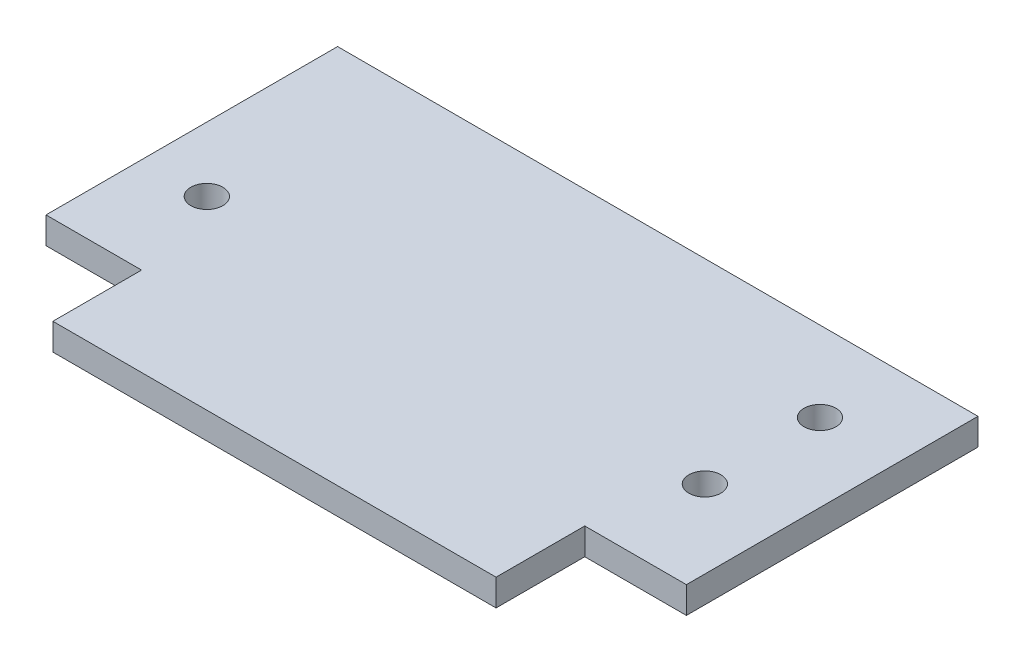
ISO-10303-21;
HEADER;
FILE_DESCRIPTION(('STEP AP214'),'2;1');
FILE_NAME('part.step','',(''),(''),'','','');
FILE_SCHEMA(('AUTOMOTIVE_DESIGN { 1 0 10303 214 1 1 1 1 }'));
ENDSEC;
DATA;
#1=APPLICATION_CONTEXT('core data for automotive mechanical design processes');
#2=APPLICATION_PROTOCOL_DEFINITION('international standard','automotive_design',2000,#1);
#3=PRODUCT_CONTEXT('',#1,'mechanical');
#4=PRODUCT('Part','Part','',(#3));
#5=PRODUCT_RELATED_PRODUCT_CATEGORY('part','',(#4));
#6=PRODUCT_DEFINITION_FORMATION('','',#4);
#7=PRODUCT_DEFINITION_CONTEXT('part definition',#1,'design');
#8=PRODUCT_DEFINITION('design','',#6,#7);
#9=PRODUCT_DEFINITION_SHAPE('','',#8);
#10=(LENGTH_UNIT() NAMED_UNIT(*) SI_UNIT(.MILLI.,.METRE.));
#11=(NAMED_UNIT(*) PLANE_ANGLE_UNIT() SI_UNIT($,.RADIAN.));
#12=(NAMED_UNIT(*) SI_UNIT($,.STERADIAN.) SOLID_ANGLE_UNIT());
#13=UNCERTAINTY_MEASURE_WITH_UNIT(LENGTH_MEASURE(1.E-05),#10,'distance_accuracy_value','');
#14=(GEOMETRIC_REPRESENTATION_CONTEXT(3) GLOBAL_UNCERTAINTY_ASSIGNED_CONTEXT((#13)) GLOBAL_UNIT_ASSIGNED_CONTEXT((#10,
#11,#12)) REPRESENTATION_CONTEXT('',''));
#15=CARTESIAN_POINT('',(0.,0.,0.));
#16=DIRECTION('',(0.,0.,1.));
#17=DIRECTION('',(1.,0.,0.));
#18=AXIS2_PLACEMENT_3D('',#15,#16,#17);
#19=CARTESIAN_POINT('',(0.,3.,0.));
#20=DIRECTION('',(0.,0.,-1.));
#21=DIRECTION('',(-1.,0.,0.));
#22=AXIS2_PLACEMENT_3D('',#19,#20,#21);
#23=PLANE('',#22);
#24=DIRECTION('',(1.,0.,0.));
#25=VECTOR('',#24,1.);
#26=CARTESIAN_POINT('',(0.,3.,0.));
#27=LINE('',#26,#25);
#28=CARTESIAN_POINT('',(10.743475016644,3.,0.));
#29=VERTEX_POINT('',#28);
#30=CARTESIAN_POINT('',(60.5718601494698,3.,0.));
#31=VERTEX_POINT('',#30);
#32=EDGE_CURVE('E151',#29,#31,#27,.T.);
#33=ORIENTED_EDGE('',*,*,#32,.F.);
#34=DIRECTION('',(0.,1.,0.));
#35=VECTOR('',#34,1.);
#36=CARTESIAN_POINT('',(10.743475016644,-50.,0.));
#37=LINE('',#36,#35);
#38=CARTESIAN_POINT('',(10.743475016644,0.,0.));
#39=VERTEX_POINT('',#38);
#40=EDGE_CURVE('E107',#39,#29,#37,.T.);
#41=ORIENTED_EDGE('',*,*,#40,.F.);
#42=DIRECTION('',(1.,0.,0.));
#43=VECTOR('',#42,1.);
#44=CARTESIAN_POINT('',(0.,0.,0.));
#45=LINE('',#44,#43);
#46=CARTESIAN_POINT('',(60.5718601494698,0.,0.));
#47=VERTEX_POINT('',#46);
#48=EDGE_CURVE('E161',#39,#47,#45,.T.);
#49=ORIENTED_EDGE('',*,*,#48,.T.);
#50=DIRECTION('',(0.,1.,0.));
#51=VECTOR('',#50,1.);
#52=CARTESIAN_POINT('',(60.5718601494698,-50.,0.));
#53=LINE('',#52,#51);
#54=EDGE_CURVE('E48',#47,#31,#53,.T.);
#55=ORIENTED_EDGE('',*,*,#54,.T.);
#56=EDGE_LOOP('',(#33,#41,#49,#55));
#57=FACE_BOUND('',#56,.T.);
#58=ADVANCED_FACE('F33',(#57),#23,.F.);
#59=CARTESIAN_POINT('',(72.,3.,0.));
#60=DIRECTION('',(-1.,0.,0.));
#61=DIRECTION('',(0.,0.,1.));
#62=AXIS2_PLACEMENT_3D('',#59,#60,#61);
#63=PLANE('',#62);
#64=DIRECTION('',(0.,1.,0.));
#65=VECTOR('',#64,1.);
#66=CARTESIAN_POINT('',(72.,-50.,-9.97199548069716));
#67=LINE('',#66,#65);
#68=CARTESIAN_POINT('',(72.,0.,-9.97199548069716));
#69=VERTEX_POINT('',#68);
#70=CARTESIAN_POINT('',(72.,3.,-9.97199548069716));
#71=VERTEX_POINT('',#70);
#72=EDGE_CURVE('E111',#69,#71,#67,.T.);
#73=ORIENTED_EDGE('',*,*,#72,.F.);
#74=DIRECTION('',(0.,0.,-1.));
#75=VECTOR('',#74,1.);
#76=CARTESIAN_POINT('',(72.,0.,0.));
#77=LINE('',#76,#75);
#78=CARTESIAN_POINT('',(72.,0.,-42.7549792));
#79=VERTEX_POINT('',#78);
#80=EDGE_CURVE('E164',#69,#79,#77,.T.);
#81=ORIENTED_EDGE('',*,*,#80,.T.);
#82=DIRECTION('',(0.,-1.,0.));
#83=VECTOR('',#82,1.);
#84=CARTESIAN_POINT('',(72.,3.,-42.7549792));
#85=LINE('',#84,#83);
#86=CARTESIAN_POINT('',(72.,3.,-42.7549792));
#87=VERTEX_POINT('',#86);
#88=EDGE_CURVE('E169',#87,#79,#85,.T.);
#89=ORIENTED_EDGE('',*,*,#88,.F.);
#90=DIRECTION('',(0.,0.,-1.));
#91=VECTOR('',#90,1.);
#92=CARTESIAN_POINT('',(72.,3.,0.));
#93=LINE('',#92,#91);
#94=EDGE_CURVE('E154',#71,#87,#93,.T.);
#95=ORIENTED_EDGE('',*,*,#94,.F.);
#96=EDGE_LOOP('',(#73,#81,#89,#95));
#97=FACE_BOUND('',#96,.T.);
#98=ADVANCED_FACE('F189',(#97),#63,.F.);
#99=CARTESIAN_POINT('',(0.,3.,0.));
#100=DIRECTION('',(0.,-1.,0.));
#101=DIRECTION('',(0.,0.,-1.));
#102=AXIS2_PLACEMENT_3D('',#99,#100,#101);
#103=PLANE('',#102);
#104=CARTESIAN_POINT('',(63.2344456145826,3.,-33.7549792));
#105=DIRECTION('',(0.,1.,0.));
#106=DIRECTION('',(0.,0.,1.));
#107=AXIS2_PLACEMENT_3D('',#104,#105,#106);
#108=CIRCLE('',#107,1.79999999999999);
#109=CARTESIAN_POINT('',(63.2344456145826,3.,-31.9549792));
#110=VERTEX_POINT('',#109);
#111=EDGE_CURVE('E120',#110,#110,#108,.T.);
#112=ORIENTED_EDGE('',*,*,#111,.F.);
#113=EDGE_LOOP('',(#112));
#114=FACE_BOUND('',#113,.T.);
#115=CARTESIAN_POINT('',(63.2344456145826,3.,-20.8097057142761));
#116=DIRECTION('',(0.,1.,0.));
#117=DIRECTION('',(0.,0.,1.));
#118=AXIS2_PLACEMENT_3D('',#115,#116,#117);
#119=CIRCLE('',#118,1.79999999999999);
#120=CARTESIAN_POINT('',(63.2344456145826,3.,-19.0097057142761));
#121=VERTEX_POINT('',#120);
#122=EDGE_CURVE('E142',#121,#121,#119,.T.);
#123=ORIENTED_EDGE('',*,*,#122,.F.);
#124=EDGE_LOOP('',(#123));
#125=FACE_BOUND('',#124,.T.);
#126=CARTESIAN_POINT('',(7.24407697678148,3.,-20.8097057142761));
#127=DIRECTION('',(0.,1.,0.));
#128=DIRECTION('',(0.,0.,1.));
#129=AXIS2_PLACEMENT_3D('',#126,#127,#128);
#130=CIRCLE('',#129,1.8);
#131=CARTESIAN_POINT('',(7.24407697678148,3.,-19.0097057142761));
#132=VERTEX_POINT('',#131);
#133=EDGE_CURVE('E136',#132,#132,#130,.T.);
#134=ORIENTED_EDGE('',*,*,#133,.F.);
#135=EDGE_LOOP('',(#134));
#136=FACE_BOUND('',#135,.T.);
#137=DIRECTION('',(-1.,0.,0.));
#138=VECTOR('',#137,1.);
#139=CARTESIAN_POINT('',(0.,3.,-9.97199548069716));
#140=LINE('',#139,#138);
#141=CARTESIAN_POINT('',(10.743475016644,3.,-9.97199548069716));
#142=VERTEX_POINT('',#141);
#143=CARTESIAN_POINT('',(0.,3.,-9.97199548069716));
#144=VERTEX_POINT('',#143);
#145=EDGE_CURVE('E99',#142,#144,#140,.T.);
#146=ORIENTED_EDGE('',*,*,#145,.F.);
#147=DIRECTION('',(0.,0.,-1.));
#148=VECTOR('',#147,1.);
#149=CARTESIAN_POINT('',(10.743475016644,3.,0.));
#150=LINE('',#149,#148);
#151=EDGE_CURVE('E104',#29,#142,#150,.T.);
#152=ORIENTED_EDGE('',*,*,#151,.F.);
#153=ORIENTED_EDGE('',*,*,#32,.T.);
#154=DIRECTION('',(0.,0.,-1.));
#155=VECTOR('',#154,1.);
#156=CARTESIAN_POINT('',(60.5718601494698,3.,0.));
#157=LINE('',#156,#155);
#158=CARTESIAN_POINT('',(60.5718601494698,3.,-9.97199548069716));
#159=VERTEX_POINT('',#158);
#160=EDGE_CURVE('E125',#31,#159,#157,.T.);
#161=ORIENTED_EDGE('',*,*,#160,.T.);
#162=DIRECTION('',(1.,0.,0.));
#163=VECTOR('',#162,1.);
#164=CARTESIAN_POINT('',(0.,3.,-9.97199548069716));
#165=LINE('',#164,#163);
#166=EDGE_CURVE('E122',#159,#71,#165,.T.);
#167=ORIENTED_EDGE('',*,*,#166,.T.);
#168=ORIENTED_EDGE('',*,*,#94,.T.);
#169=DIRECTION('',(-1.,0.,0.));
#170=VECTOR('',#169,1.);
#171=CARTESIAN_POINT('',(0.,3.,-42.7549792));
#172=LINE('',#171,#170);
#173=CARTESIAN_POINT('',(0.,3.,-42.7549792));
#174=VERTEX_POINT('',#173);
#175=EDGE_CURVE('E156',#87,#174,#172,.T.);
#176=ORIENTED_EDGE('',*,*,#175,.T.);
#177=DIRECTION('',(0.,0.,1.));
#178=VECTOR('',#177,1.);
#179=CARTESIAN_POINT('',(0.,3.,0.));
#180=LINE('',#179,#178);
#181=EDGE_CURVE('E116',#174,#144,#180,.T.);
#182=ORIENTED_EDGE('',*,*,#181,.T.);
#183=EDGE_LOOP('',(#146,#152,#153,#161,#167,#168,#176,#182));
#184=FACE_BOUND('',#183,.T.);
#185=ADVANCED_FACE('F114',(#114,#125,#136,#184),#103,.F.);
#186=CARTESIAN_POINT('',(0.,0.,0.));
#187=DIRECTION('',(0.,-1.,0.));
#188=DIRECTION('',(0.,0.,-1.));
#189=AXIS2_PLACEMENT_3D('',#186,#187,#188);
#190=PLANE('',#189);
#191=DIRECTION('',(0.,0.,1.));
#192=VECTOR('',#191,1.);
#193=CARTESIAN_POINT('',(10.743475016644,0.,0.));
#194=LINE('',#193,#192);
#195=CARTESIAN_POINT('',(10.743475016644,0.,-9.97199548069716));
#196=VERTEX_POINT('',#195);
#197=EDGE_CURVE('E11',#196,#39,#194,.T.);
#198=ORIENTED_EDGE('',*,*,#197,.F.);
#199=DIRECTION('',(1.,0.,0.));
#200=VECTOR('',#199,1.);
#201=CARTESIAN_POINT('',(0.,0.,-9.97199548069716));
#202=LINE('',#201,#200);
#203=CARTESIAN_POINT('',(0.,0.,-9.97199548069716));
#204=VERTEX_POINT('',#203);
#205=EDGE_CURVE('E41',#204,#196,#202,.T.);
#206=ORIENTED_EDGE('',*,*,#205,.F.);
#207=DIRECTION('',(0.,0.,1.));
#208=VECTOR('',#207,1.);
#209=CARTESIAN_POINT('',(0.,0.,0.));
#210=LINE('',#209,#208);
#211=CARTESIAN_POINT('',(0.,0.,-42.7549792));
#212=VERTEX_POINT('',#211);
#213=EDGE_CURVE('E135',#212,#204,#210,.T.);
#214=ORIENTED_EDGE('',*,*,#213,.F.);
#215=DIRECTION('',(-1.,0.,0.));
#216=VECTOR('',#215,1.);
#217=CARTESIAN_POINT('',(0.,0.,-42.7549792));
#218=LINE('',#217,#216);
#219=EDGE_CURVE('E152',#79,#212,#218,.T.);
#220=ORIENTED_EDGE('',*,*,#219,.F.);
#221=ORIENTED_EDGE('',*,*,#80,.F.);
#222=DIRECTION('',(-1.,0.,0.));
#223=VECTOR('',#222,1.);
#224=CARTESIAN_POINT('',(0.,0.,-9.97199548069716));
#225=LINE('',#224,#223);
#226=CARTESIAN_POINT('',(60.5718601494698,0.,-9.97199548069716));
#227=VERTEX_POINT('',#226);
#228=EDGE_CURVE('E174',#69,#227,#225,.T.);
#229=ORIENTED_EDGE('',*,*,#228,.T.);
#230=DIRECTION('',(0.,0.,1.));
#231=VECTOR('',#230,1.);
#232=CARTESIAN_POINT('',(60.5718601494698,0.,0.));
#233=LINE('',#232,#231);
#234=EDGE_CURVE('E172',#227,#47,#233,.T.);
#235=ORIENTED_EDGE('',*,*,#234,.T.);
#236=ORIENTED_EDGE('',*,*,#48,.F.);
#237=EDGE_LOOP('',(#198,#206,#214,#220,#221,#229,#235,#236));
#238=FACE_BOUND('',#237,.T.);
#239=CARTESIAN_POINT('',(7.24407697678148,0.,-20.8097057142761));
#240=DIRECTION('',(0.,1.,0.));
#241=DIRECTION('',(0.,0.,1.));
#242=AXIS2_PLACEMENT_3D('',#239,#240,#241);
#243=CIRCLE('',#242,1.8);
#244=CARTESIAN_POINT('',(7.24407697678148,0.,-19.0097057142761));
#245=VERTEX_POINT('',#244);
#246=EDGE_CURVE('E132',#245,#245,#243,.T.);
#247=ORIENTED_EDGE('',*,*,#246,.T.);
#248=EDGE_LOOP('',(#247));
#249=FACE_BOUND('',#248,.T.);
#250=CARTESIAN_POINT('',(63.2344456145826,0.,-20.8097057142761));
#251=DIRECTION('',(0.,1.,0.));
#252=DIRECTION('',(0.,0.,1.));
#253=AXIS2_PLACEMENT_3D('',#250,#251,#252);
#254=CIRCLE('',#253,1.79999999999999);
#255=CARTESIAN_POINT('',(63.2344456145826,0.,-19.0097057142761));
#256=VERTEX_POINT('',#255);
#257=EDGE_CURVE('E139',#256,#256,#254,.T.);
#258=ORIENTED_EDGE('',*,*,#257,.T.);
#259=EDGE_LOOP('',(#258));
#260=FACE_BOUND('',#259,.T.);
#261=CARTESIAN_POINT('',(63.2344456145826,0.,-33.7549792));
#262=DIRECTION('',(0.,1.,0.));
#263=DIRECTION('',(0.,0.,1.));
#264=AXIS2_PLACEMENT_3D('',#261,#262,#263);
#265=CIRCLE('',#264,1.79999999999999);
#266=CARTESIAN_POINT('',(63.2344456145826,0.,-31.9549792));
#267=VERTEX_POINT('',#266);
#268=EDGE_CURVE('E145',#267,#267,#265,.T.);
#269=ORIENTED_EDGE('',*,*,#268,.T.);
#270=EDGE_LOOP('',(#269));
#271=FACE_BOUND('',#270,.T.);
#272=ADVANCED_FACE('F178',(#238,#249,#260,#271),#190,.T.);
#273=CARTESIAN_POINT('',(0.,3.,0.));
#274=DIRECTION('',(1.,0.,0.));
#275=DIRECTION('',(0.,0.,-1.));
#276=AXIS2_PLACEMENT_3D('',#273,#274,#275);
#277=PLANE('',#276);
#278=ORIENTED_EDGE('',*,*,#213,.T.);
#279=DIRECTION('',(0.,1.,0.));
#280=VECTOR('',#279,1.);
#281=CARTESIAN_POINT('',(0.,-50.,-9.97199548069716));
#282=LINE('',#281,#280);
#283=EDGE_CURVE('E56',#204,#144,#282,.T.);
#284=ORIENTED_EDGE('',*,*,#283,.T.);
#285=ORIENTED_EDGE('',*,*,#181,.F.);
#286=DIRECTION('',(0.,-1.,0.));
#287=VECTOR('',#286,1.);
#288=CARTESIAN_POINT('',(0.,3.,-42.7549792));
#289=LINE('',#288,#287);
#290=EDGE_CURVE('E158',#174,#212,#289,.T.);
#291=ORIENTED_EDGE('',*,*,#290,.T.);
#292=EDGE_LOOP('',(#278,#284,#285,#291));
#293=FACE_BOUND('',#292,.T.);
#294=ADVANCED_FACE('F35',(#293),#277,.F.);
#295=CARTESIAN_POINT('',(0.,3.,-42.7549792));
#296=DIRECTION('',(0.,0.,1.));
#297=DIRECTION('',(1.,0.,0.));
#298=AXIS2_PLACEMENT_3D('',#295,#296,#297);
#299=PLANE('',#298);
#300=ORIENTED_EDGE('',*,*,#219,.T.);
#301=ORIENTED_EDGE('',*,*,#290,.F.);
#302=ORIENTED_EDGE('',*,*,#175,.F.);
#303=ORIENTED_EDGE('',*,*,#88,.T.);
#304=EDGE_LOOP('',(#300,#301,#302,#303));
#305=FACE_BOUND('',#304,.T.);
#306=ADVANCED_FACE('F198',(#305),#299,.F.);
#307=CARTESIAN_POINT('',(63.2344456145826,0.,-33.7549792));
#308=DIRECTION('',(0.,1.,0.));
#309=DIRECTION('',(0.,0.,1.));
#310=AXIS2_PLACEMENT_3D('',#307,#308,#309);
#311=CYLINDRICAL_SURFACE('',#310,1.79999999999999);
#312=ORIENTED_EDGE('',*,*,#268,.F.);
#313=EDGE_LOOP('',(#312));
#314=FACE_BOUND('',#313,.T.);
#315=ORIENTED_EDGE('',*,*,#111,.T.);
#316=EDGE_LOOP('',(#315));
#317=FACE_BOUND('',#316,.T.);
#318=ADVANCED_FACE('F200',(#314,#317),#311,.F.);
#319=CARTESIAN_POINT('',(63.2344456145826,0.,-20.8097057142761));
#320=DIRECTION('',(0.,1.,0.));
#321=DIRECTION('',(0.,0.,1.));
#322=AXIS2_PLACEMENT_3D('',#319,#320,#321);
#323=CYLINDRICAL_SURFACE('',#322,1.79999999999999);
#324=ORIENTED_EDGE('',*,*,#257,.F.);
#325=EDGE_LOOP('',(#324));
#326=FACE_BOUND('',#325,.T.);
#327=ORIENTED_EDGE('',*,*,#122,.T.);
#328=EDGE_LOOP('',(#327));
#329=FACE_BOUND('',#328,.T.);
#330=ADVANCED_FACE('F206',(#326,#329),#323,.F.);
#331=CARTESIAN_POINT('',(7.24407697678148,0.,-20.8097057142761));
#332=DIRECTION('',(0.,1.,0.));
#333=DIRECTION('',(0.,0.,1.));
#334=AXIS2_PLACEMENT_3D('',#331,#332,#333);
#335=CYLINDRICAL_SURFACE('',#334,1.8);
#336=ORIENTED_EDGE('',*,*,#246,.F.);
#337=EDGE_LOOP('',(#336));
#338=FACE_BOUND('',#337,.T.);
#339=ORIENTED_EDGE('',*,*,#133,.T.);
#340=EDGE_LOOP('',(#339));
#341=FACE_BOUND('',#340,.T.);
#342=ADVANCED_FACE('F228',(#338,#341),#335,.F.);
#343=CARTESIAN_POINT('',(0.,-50.,-9.97199548069716));
#344=DIRECTION('',(0.,0.,1.));
#345=DIRECTION('',(1.,0.,0.));
#346=AXIS2_PLACEMENT_3D('',#343,#344,#345);
#347=PLANE('',#346);
#348=ORIENTED_EDGE('',*,*,#72,.T.);
#349=ORIENTED_EDGE('',*,*,#166,.F.);
#350=DIRECTION('',(0.,1.,0.));
#351=VECTOR('',#350,1.);
#352=CARTESIAN_POINT('',(60.5718601494698,-50.,-9.97199548069716));
#353=LINE('',#352,#351);
#354=EDGE_CURVE('E128',#227,#159,#353,.T.);
#355=ORIENTED_EDGE('',*,*,#354,.F.);
#356=ORIENTED_EDGE('',*,*,#228,.F.);
#357=EDGE_LOOP('',(#348,#349,#355,#356));
#358=FACE_BOUND('',#357,.T.);
#359=ADVANCED_FACE('F185',(#358),#347,.T.);
#360=CARTESIAN_POINT('',(60.5718601494698,-50.,0.));
#361=DIRECTION('',(1.,0.,0.));
#362=DIRECTION('',(0.,0.,-1.));
#363=AXIS2_PLACEMENT_3D('',#360,#361,#362);
#364=PLANE('',#363);
#365=ORIENTED_EDGE('',*,*,#354,.T.);
#366=ORIENTED_EDGE('',*,*,#160,.F.);
#367=ORIENTED_EDGE('',*,*,#54,.F.);
#368=ORIENTED_EDGE('',*,*,#234,.F.);
#369=EDGE_LOOP('',(#365,#366,#367,#368));
#370=FACE_BOUND('',#369,.T.);
#371=ADVANCED_FACE('F193',(#370),#364,.T.);
#372=CARTESIAN_POINT('',(10.743475016644,-50.,0.));
#373=DIRECTION('',(1.,0.,0.));
#374=DIRECTION('',(0.,0.,-1.));
#375=AXIS2_PLACEMENT_3D('',#372,#373,#374);
#376=PLANE('',#375);
#377=ORIENTED_EDGE('',*,*,#197,.T.);
#378=ORIENTED_EDGE('',*,*,#40,.T.);
#379=ORIENTED_EDGE('',*,*,#151,.T.);
#380=DIRECTION('',(0.,1.,0.));
#381=VECTOR('',#380,1.);
#382=CARTESIAN_POINT('',(10.743475016644,-50.,-9.97199548069716));
#383=LINE('',#382,#381);
#384=EDGE_CURVE('E95',#196,#142,#383,.T.);
#385=ORIENTED_EDGE('',*,*,#384,.F.);
#386=EDGE_LOOP('',(#377,#378,#379,#385));
#387=FACE_BOUND('',#386,.T.);
#388=ADVANCED_FACE('F105',(#387),#376,.F.);
#389=CARTESIAN_POINT('',(0.,-50.,-9.97199548069716));
#390=DIRECTION('',(0.,0.,-1.));
#391=DIRECTION('',(-1.,0.,0.));
#392=AXIS2_PLACEMENT_3D('',#389,#390,#391);
#393=PLANE('',#392);
#394=ORIENTED_EDGE('',*,*,#205,.T.);
#395=ORIENTED_EDGE('',*,*,#384,.T.);
#396=ORIENTED_EDGE('',*,*,#145,.T.);
#397=ORIENTED_EDGE('',*,*,#283,.F.);
#398=EDGE_LOOP('',(#394,#395,#396,#397));
#399=FACE_BOUND('',#398,.T.);
#400=ADVANCED_FACE('F97',(#399),#393,.F.);
#401=CLOSED_SHELL('',(#58,#98,#185,#272,#294,#306,#318,#330,#342,#359,#371,#388,#400));
#402=MANIFOLD_SOLID_BREP('B2',#401);
#403=ADVANCED_BREP_SHAPE_REPRESENTATION('',(#18,#402),#14);
#404=SHAPE_DEFINITION_REPRESENTATION(#9,#403);
ENDSEC;
END-ISO-10303-21;
